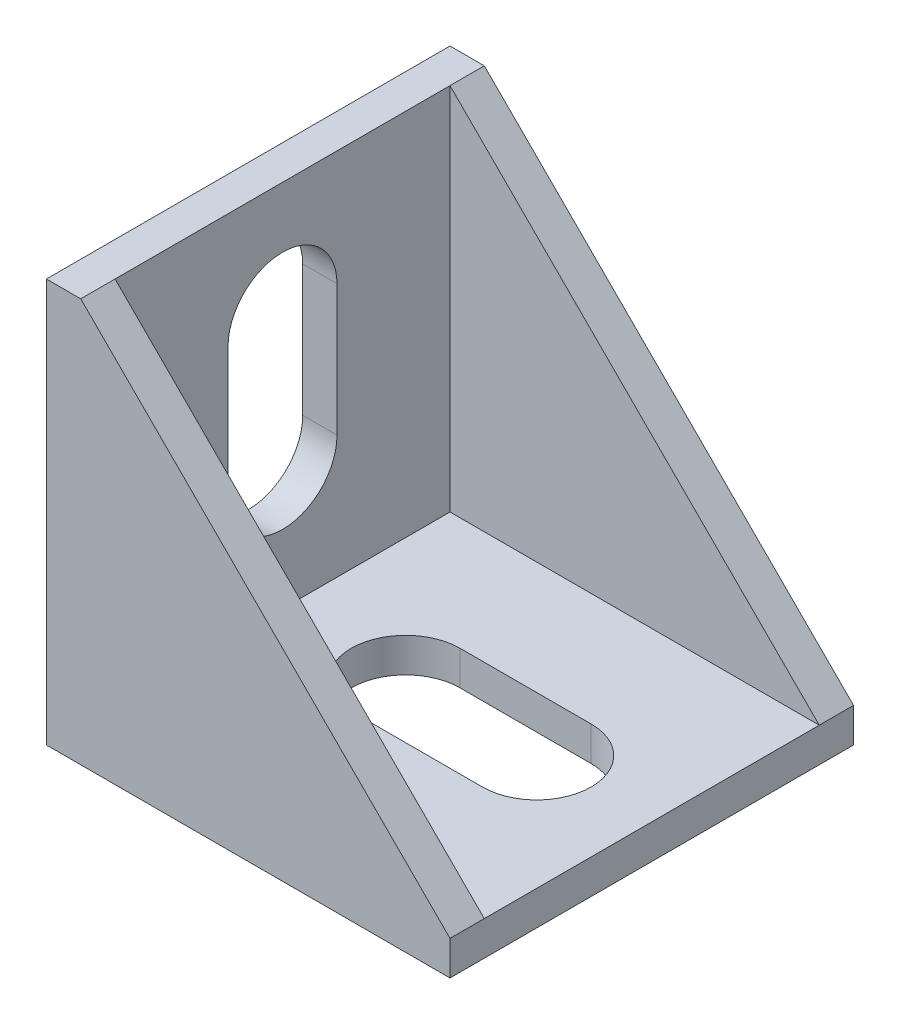
ISO-10303-21;
HEADER;
FILE_DESCRIPTION(('STEP AP214'),'2;1');
FILE_NAME('part.step','',(''),(''),'','','');
FILE_SCHEMA(('AUTOMOTIVE_DESIGN { 1 0 10303 214 1 1 1 1 }'));
ENDSEC;
DATA;
#1=APPLICATION_CONTEXT('core data for automotive mechanical design processes');
#2=APPLICATION_PROTOCOL_DEFINITION('international standard','automotive_design',2000,#1);
#3=PRODUCT_CONTEXT('',#1,'mechanical');
#4=PRODUCT('Part','Part','',(#3));
#5=PRODUCT_RELATED_PRODUCT_CATEGORY('part','',(#4));
#6=PRODUCT_DEFINITION_FORMATION('','',#4);
#7=PRODUCT_DEFINITION_CONTEXT('part definition',#1,'design');
#8=PRODUCT_DEFINITION('design','',#6,#7);
#9=PRODUCT_DEFINITION_SHAPE('','',#8);
#10=(LENGTH_UNIT() NAMED_UNIT(*) SI_UNIT(.MILLI.,.METRE.));
#11=(NAMED_UNIT(*) PLANE_ANGLE_UNIT() SI_UNIT($,.RADIAN.));
#12=(NAMED_UNIT(*) SI_UNIT($,.STERADIAN.) SOLID_ANGLE_UNIT());
#13=UNCERTAINTY_MEASURE_WITH_UNIT(LENGTH_MEASURE(1.E-05),#10,'distance_accuracy_value','');
#14=(GEOMETRIC_REPRESENTATION_CONTEXT(3) GLOBAL_UNCERTAINTY_ASSIGNED_CONTEXT((#13)) GLOBAL_UNIT_ASSIGNED_CONTEXT((#10,
#11,#12)) REPRESENTATION_CONTEXT('',''));
#15=CARTESIAN_POINT('',(0.,0.,0.));
#16=DIRECTION('',(0.,0.,1.));
#17=DIRECTION('',(1.,0.,0.));
#18=AXIS2_PLACEMENT_3D('',#15,#16,#17);
#19=CARTESIAN_POINT('',(0.,1.7,0.));
#20=DIRECTION('',(0.,-1.,0.));
#21=DIRECTION('',(0.,0.,-1.));
#22=AXIS2_PLACEMENT_3D('',#19,#20,#21);
#23=PLANE('',#22);
#24=CARTESIAN_POINT('',(-2.2,1.7,0.));
#25=DIRECTION('',(0.,1.,0.));
#26=DIRECTION('',(0.,0.,1.));
#27=AXIS2_PLACEMENT_3D('',#24,#25,#26);
#28=CIRCLE('',#27,2.7);
#29=CARTESIAN_POINT('',(-2.2,1.7,-2.7));
#30=VERTEX_POINT('',#29);
#31=CARTESIAN_POINT('',(-2.2,1.7,2.7));
#32=VERTEX_POINT('',#31);
#33=EDGE_CURVE('E243',#30,#32,#28,.T.);
#34=ORIENTED_EDGE('',*,*,#33,.F.);
#35=DIRECTION('',(-1.,0.,0.));
#36=VECTOR('',#35,1.);
#37=CARTESIAN_POINT('',(-2.2,1.7,-2.7));
#38=LINE('',#37,#36);
#39=CARTESIAN_POINT('',(4.3,1.7,-2.7));
#40=VERTEX_POINT('',#39);
#41=EDGE_CURVE('E251',#40,#30,#38,.T.);
#42=ORIENTED_EDGE('',*,*,#41,.F.);
#43=CARTESIAN_POINT('',(4.3,1.7,0.));
#44=DIRECTION('',(0.,1.,0.));
#45=DIRECTION('',(0.,0.,1.));
#46=AXIS2_PLACEMENT_3D('',#43,#44,#45);
#47=CIRCLE('',#46,2.7);
#48=CARTESIAN_POINT('',(4.3,1.7,2.7));
#49=VERTEX_POINT('',#48);
#50=EDGE_CURVE('E248',#49,#40,#47,.T.);
#51=ORIENTED_EDGE('',*,*,#50,.F.);
#52=DIRECTION('',(1.,0.,0.));
#53=VECTOR('',#52,1.);
#54=CARTESIAN_POINT('',(-2.2,1.7,2.7));
#55=LINE('',#54,#53);
#56=EDGE_CURVE('E245',#32,#49,#55,.T.);
#57=ORIENTED_EDGE('',*,*,#56,.F.);
#58=EDGE_LOOP('',(#34,#42,#51,#57));
#59=FACE_BOUND('',#58,.T.);
#60=DIRECTION('',(-1.,0.,0.));
#61=VECTOR('',#60,1.);
#62=CARTESIAN_POINT('',(10.,1.7,-8.3));
#63=LINE('',#62,#61);
#64=CARTESIAN_POINT('',(10.,1.7,-8.3));
#65=VERTEX_POINT('',#64);
#66=CARTESIAN_POINT('',(-8.3,1.7,-8.3));
#67=VERTEX_POINT('',#66);
#68=EDGE_CURVE('E185',#65,#67,#63,.T.);
#69=ORIENTED_EDGE('',*,*,#68,.T.);
#70=DIRECTION('',(0.,0.,-1.));
#71=VECTOR('',#70,1.);
#72=CARTESIAN_POINT('',(-8.3,1.7,-10.));
#73=LINE('',#72,#71);
#74=CARTESIAN_POINT('',(-8.3,1.7,8.3));
#75=VERTEX_POINT('',#74);
#76=EDGE_CURVE('E239',#75,#67,#73,.T.);
#77=ORIENTED_EDGE('',*,*,#76,.F.);
#78=DIRECTION('',(-1.,0.,0.));
#79=VECTOR('',#78,1.);
#80=CARTESIAN_POINT('',(10.,1.7,8.3));
#81=LINE('',#80,#79);
#82=CARTESIAN_POINT('',(10.,1.7,8.3));
#83=VERTEX_POINT('',#82);
#84=EDGE_CURVE('E194',#83,#75,#81,.T.);
#85=ORIENTED_EDGE('',*,*,#84,.F.);
#86=DIRECTION('',(0.,0.,-1.));
#87=VECTOR('',#86,1.);
#88=CARTESIAN_POINT('',(10.,1.7,10.));
#89=LINE('',#88,#87);
#90=EDGE_CURVE('E178',#83,#65,#89,.T.);
#91=ORIENTED_EDGE('',*,*,#90,.T.);
#92=EDGE_LOOP('',(#69,#77,#85,#91));
#93=FACE_BOUND('',#92,.T.);
#94=ADVANCED_FACE('F50',(#59,#93),#23,.F.);
#95=CARTESIAN_POINT('',(-8.3,20.,-10.));
#96=DIRECTION('',(-1.,0.,0.));
#97=DIRECTION('',(0.,0.,1.));
#98=AXIS2_PLACEMENT_3D('',#95,#96,#97);
#99=PLANE('',#98);
#100=DIRECTION('',(0.,-1.,0.));
#101=VECTOR('',#100,1.);
#102=CARTESIAN_POINT('',(-8.3,14.3,2.7));
#103=LINE('',#102,#101);
#104=CARTESIAN_POINT('',(-8.3,14.3,2.7));
#105=VERTEX_POINT('',#104);
#106=CARTESIAN_POINT('',(-8.3,7.8,2.7));
#107=VERTEX_POINT('',#106);
#108=EDGE_CURVE('E371',#105,#107,#103,.T.);
#109=ORIENTED_EDGE('',*,*,#108,.F.);
#110=CARTESIAN_POINT('',(-8.3,14.3,0.));
#111=DIRECTION('',(1.,0.,0.));
#112=DIRECTION('',(0.,0.,-1.));
#113=AXIS2_PLACEMENT_3D('',#110,#111,#112);
#114=CIRCLE('',#113,2.7);
#115=CARTESIAN_POINT('',(-8.3,14.3,-2.7));
#116=VERTEX_POINT('',#115);
#117=EDGE_CURVE('E358',#116,#105,#114,.T.);
#118=ORIENTED_EDGE('',*,*,#117,.F.);
#119=DIRECTION('',(0.,1.,0.));
#120=VECTOR('',#119,1.);
#121=CARTESIAN_POINT('',(-8.3,14.3,-2.7));
#122=LINE('',#121,#120);
#123=CARTESIAN_POINT('',(-8.3,7.8,-2.7));
#124=VERTEX_POINT('',#123);
#125=EDGE_CURVE('E377',#124,#116,#122,.T.);
#126=ORIENTED_EDGE('',*,*,#125,.F.);
#127=CARTESIAN_POINT('',(-8.3,7.8,0.));
#128=DIRECTION('',(1.,0.,0.));
#129=DIRECTION('',(0.,0.,-1.));
#130=AXIS2_PLACEMENT_3D('',#127,#128,#129);
#131=CIRCLE('',#130,2.7);
#132=EDGE_CURVE('E374',#107,#124,#131,.T.);
#133=ORIENTED_EDGE('',*,*,#132,.F.);
#134=EDGE_LOOP('',(#109,#118,#126,#133));
#135=FACE_BOUND('',#134,.T.);
#136=DIRECTION('',(0.,-1.,0.));
#137=VECTOR('',#136,1.);
#138=CARTESIAN_POINT('',(-8.3,20.,-8.3));
#139=LINE('',#138,#137);
#140=CARTESIAN_POINT('',(-8.3,20.,-8.3));
#141=VERTEX_POINT('',#140);
#142=EDGE_CURVE('E187',#141,#67,#139,.T.);
#143=ORIENTED_EDGE('',*,*,#142,.F.);
#144=DIRECTION('',(0.,0.,-1.));
#145=VECTOR('',#144,1.);
#146=CARTESIAN_POINT('',(-8.3,20.,-10.));
#147=LINE('',#146,#145);
#148=CARTESIAN_POINT('',(-8.3,20.,8.3));
#149=VERTEX_POINT('',#148);
#150=EDGE_CURVE('E230',#149,#141,#147,.T.);
#151=ORIENTED_EDGE('',*,*,#150,.F.);
#152=DIRECTION('',(0.,1.,0.));
#153=VECTOR('',#152,1.);
#154=CARTESIAN_POINT('',(-8.3,20.,8.3));
#155=LINE('',#154,#153);
#156=EDGE_CURVE('E191',#75,#149,#155,.T.);
#157=ORIENTED_EDGE('',*,*,#156,.F.);
#158=ORIENTED_EDGE('',*,*,#76,.T.);
#159=EDGE_LOOP('',(#143,#151,#157,#158));
#160=FACE_BOUND('',#159,.T.);
#161=ADVANCED_FACE('F296',(#135,#160),#99,.F.);
#162=CARTESIAN_POINT('',(0.,0.,0.));
#163=DIRECTION('',(0.,-1.,0.));
#164=DIRECTION('',(0.,0.,-1.));
#165=AXIS2_PLACEMENT_3D('',#162,#163,#164);
#166=PLANE('',#165);
#167=DIRECTION('',(0.,0.,-1.));
#168=VECTOR('',#167,1.);
#169=CARTESIAN_POINT('',(10.,0.,10.));
#170=LINE('',#169,#168);
#171=CARTESIAN_POINT('',(10.,0.,10.));
#172=VERTEX_POINT('',#171);
#173=CARTESIAN_POINT('',(10.,0.,-10.));
#174=VERTEX_POINT('',#173);
#175=EDGE_CURVE('E207',#172,#174,#170,.T.);
#176=ORIENTED_EDGE('',*,*,#175,.F.);
#177=DIRECTION('',(1.,0.,0.));
#178=VECTOR('',#177,1.);
#179=CARTESIAN_POINT('',(-10.,0.,10.));
#180=LINE('',#179,#178);
#181=CARTESIAN_POINT('',(-10.,0.,10.));
#182=VERTEX_POINT('',#181);
#183=EDGE_CURVE('E196',#182,#172,#180,.T.);
#184=ORIENTED_EDGE('',*,*,#183,.F.);
#185=DIRECTION('',(0.,0.,1.));
#186=VECTOR('',#185,1.);
#187=CARTESIAN_POINT('',(-10.,0.,10.));
#188=LINE('',#187,#186);
#189=CARTESIAN_POINT('',(-10.,0.,-10.));
#190=VERTEX_POINT('',#189);
#191=EDGE_CURVE('E201',#190,#182,#188,.T.);
#192=ORIENTED_EDGE('',*,*,#191,.F.);
#193=DIRECTION('',(-1.,0.,0.));
#194=VECTOR('',#193,1.);
#195=CARTESIAN_POINT('',(-10.,0.,-10.));
#196=LINE('',#195,#194);
#197=EDGE_CURVE('E209',#174,#190,#196,.T.);
#198=ORIENTED_EDGE('',*,*,#197,.F.);
#199=EDGE_LOOP('',(#176,#184,#192,#198));
#200=FACE_BOUND('',#199,.T.);
#201=DIRECTION('',(-1.,0.,0.));
#202=VECTOR('',#201,1.);
#203=CARTESIAN_POINT('',(-2.2,0.,-2.7));
#204=LINE('',#203,#202);
#205=CARTESIAN_POINT('',(4.3,0.,-2.7));
#206=VERTEX_POINT('',#205);
#207=CARTESIAN_POINT('',(-2.2,0.,-2.7));
#208=VERTEX_POINT('',#207);
#209=EDGE_CURVE('E246',#206,#208,#204,.T.);
#210=ORIENTED_EDGE('',*,*,#209,.T.);
#211=CARTESIAN_POINT('',(-2.2,0.,0.));
#212=DIRECTION('',(0.,1.,0.));
#213=DIRECTION('',(0.,0.,1.));
#214=AXIS2_PLACEMENT_3D('',#211,#212,#213);
#215=CIRCLE('',#214,2.7);
#216=CARTESIAN_POINT('',(-2.2,0.,2.7));
#217=VERTEX_POINT('',#216);
#218=EDGE_CURVE('E229',#208,#217,#215,.T.);
#219=ORIENTED_EDGE('',*,*,#218,.T.);
#220=DIRECTION('',(1.,0.,0.));
#221=VECTOR('',#220,1.);
#222=CARTESIAN_POINT('',(-2.2,0.,2.7));
#223=LINE('',#222,#221);
#224=CARTESIAN_POINT('',(4.3,0.,2.7));
#225=VERTEX_POINT('',#224);
#226=EDGE_CURVE('E233',#217,#225,#223,.T.);
#227=ORIENTED_EDGE('',*,*,#226,.T.);
#228=CARTESIAN_POINT('',(4.3,0.,0.));
#229=DIRECTION('',(0.,1.,0.));
#230=DIRECTION('',(0.,0.,1.));
#231=AXIS2_PLACEMENT_3D('',#228,#229,#230);
#232=CIRCLE('',#231,2.7);
#233=EDGE_CURVE('E256',#225,#206,#232,.T.);
#234=ORIENTED_EDGE('',*,*,#233,.T.);
#235=EDGE_LOOP('',(#210,#219,#227,#234));
#236=FACE_BOUND('',#235,.T.);
#237=ADVANCED_FACE('F276',(#200,#236),#166,.T.);
#238=CARTESIAN_POINT('',(10.,1.7,10.));
#239=DIRECTION('',(-1.,0.,0.));
#240=DIRECTION('',(0.,0.,1.));
#241=AXIS2_PLACEMENT_3D('',#238,#239,#240);
#242=PLANE('',#241);
#243=DIRECTION('',(0.,-1.,0.));
#244=VECTOR('',#243,1.);
#245=CARTESIAN_POINT('',(10.,1.7,-10.));
#246=LINE('',#245,#244);
#247=CARTESIAN_POINT('',(10.,1.69999999999999,-10.));
#248=VERTEX_POINT('',#247);
#249=EDGE_CURVE('E181',#248,#174,#246,.T.);
#250=ORIENTED_EDGE('',*,*,#249,.F.);
#251=DIRECTION('',(0.,0.,1.));
#252=VECTOR('',#251,1.);
#253=CARTESIAN_POINT('',(10.,1.69999999999999,-8.3));
#254=LINE('',#253,#252);
#255=EDGE_CURVE('E166',#248,#65,#254,.T.);
#256=ORIENTED_EDGE('',*,*,#255,.T.);
#257=ORIENTED_EDGE('',*,*,#90,.F.);
#258=DIRECTION('',(0.,0.,1.));
#259=VECTOR('',#258,1.);
#260=CARTESIAN_POINT('',(10.,1.69999999999999,10.));
#261=LINE('',#260,#259);
#262=CARTESIAN_POINT('',(10.,1.69999999999999,10.));
#263=VERTEX_POINT('',#262);
#264=EDGE_CURVE('E182',#83,#263,#261,.T.);
#265=ORIENTED_EDGE('',*,*,#264,.T.);
#266=DIRECTION('',(0.,-1.,0.));
#267=VECTOR('',#266,1.);
#268=CARTESIAN_POINT('',(10.,1.7,10.));
#269=LINE('',#268,#267);
#270=EDGE_CURVE('E195',#263,#172,#269,.T.);
#271=ORIENTED_EDGE('',*,*,#270,.T.);
#272=ORIENTED_EDGE('',*,*,#175,.T.);
#273=EDGE_LOOP('',(#250,#256,#257,#265,#271,#272));
#274=FACE_BOUND('',#273,.T.);
#275=ADVANCED_FACE('F175',(#274),#242,.F.);
#276=CARTESIAN_POINT('',(-10.,1.7,-10.));
#277=DIRECTION('',(0.,0.,1.));
#278=DIRECTION('',(1.,0.,0.));
#279=AXIS2_PLACEMENT_3D('',#276,#277,#278);
#280=PLANE('',#279);
#281=DIRECTION('',(-1.,0.,0.));
#282=VECTOR('',#281,1.);
#283=CARTESIAN_POINT('',(-10.,20.,-10.));
#284=LINE('',#283,#282);
#285=CARTESIAN_POINT('',(-8.30000000000007,20.,-10.));
#286=VERTEX_POINT('',#285);
#287=CARTESIAN_POINT('',(-10.,20.,-10.));
#288=VERTEX_POINT('',#287);
#289=EDGE_CURVE('E226',#286,#288,#284,.T.);
#290=ORIENTED_EDGE('',*,*,#289,.F.);
#291=DIRECTION('',(0.707106781186549,-0.707106781186546,0.));
#292=VECTOR('',#291,1.);
#293=CARTESIAN_POINT('',(10.,1.69999999999999,-10.));
#294=LINE('',#293,#292);
#295=EDGE_CURVE('E221',#286,#248,#294,.T.);
#296=ORIENTED_EDGE('',*,*,#295,.T.);
#297=ORIENTED_EDGE('',*,*,#249,.T.);
#298=ORIENTED_EDGE('',*,*,#197,.T.);
#299=DIRECTION('',(0.,-1.,0.));
#300=VECTOR('',#299,1.);
#301=CARTESIAN_POINT('',(-10.,1.7,-10.));
#302=LINE('',#301,#300);
#303=EDGE_CURVE('E214',#288,#190,#302,.T.);
#304=ORIENTED_EDGE('',*,*,#303,.F.);
#305=EDGE_LOOP('',(#290,#296,#297,#298,#304));
#306=FACE_BOUND('',#305,.T.);
#307=ADVANCED_FACE('F223',(#306),#280,.F.);
#308=CARTESIAN_POINT('',(-10.,1.7,10.));
#309=DIRECTION('',(1.,0.,0.));
#310=DIRECTION('',(0.,0.,-1.));
#311=AXIS2_PLACEMENT_3D('',#308,#309,#310);
#312=PLANE('',#311);
#313=DIRECTION('',(0.,-1.,0.));
#314=VECTOR('',#313,1.);
#315=CARTESIAN_POINT('',(-10.,14.3,-2.7));
#316=LINE('',#315,#314);
#317=CARTESIAN_POINT('',(-10.,14.3,-2.7));
#318=VERTEX_POINT('',#317);
#319=CARTESIAN_POINT('',(-10.,7.8,-2.7));
#320=VERTEX_POINT('',#319);
#321=EDGE_CURVE('E365',#318,#320,#316,.T.);
#322=ORIENTED_EDGE('',*,*,#321,.F.);
#323=CARTESIAN_POINT('',(-10.,14.3,0.));
#324=DIRECTION('',(1.,0.,0.));
#325=DIRECTION('',(0.,0.,-1.));
#326=AXIS2_PLACEMENT_3D('',#323,#324,#325);
#327=CIRCLE('',#326,2.7);
#328=CARTESIAN_POINT('',(-10.,14.3,2.7));
#329=VERTEX_POINT('',#328);
#330=EDGE_CURVE('E368',#329,#318,#327,.F.);
#331=ORIENTED_EDGE('',*,*,#330,.F.);
#332=DIRECTION('',(0.,1.,0.));
#333=VECTOR('',#332,1.);
#334=CARTESIAN_POINT('',(-10.,14.3,2.7));
#335=LINE('',#334,#333);
#336=CARTESIAN_POINT('',(-10.,7.8,2.7));
#337=VERTEX_POINT('',#336);
#338=EDGE_CURVE('E242',#337,#329,#335,.T.);
#339=ORIENTED_EDGE('',*,*,#338,.F.);
#340=CARTESIAN_POINT('',(-10.,7.8,0.));
#341=DIRECTION('',(1.,0.,0.));
#342=DIRECTION('',(0.,0.,-1.));
#343=AXIS2_PLACEMENT_3D('',#340,#341,#342);
#344=CIRCLE('',#343,2.7);
#345=EDGE_CURVE('E362',#320,#337,#344,.F.);
#346=ORIENTED_EDGE('',*,*,#345,.F.);
#347=EDGE_LOOP('',(#322,#331,#339,#346));
#348=FACE_BOUND('',#347,.T.);
#349=ORIENTED_EDGE('',*,*,#191,.T.);
#350=DIRECTION('',(0.,-1.,0.));
#351=VECTOR('',#350,1.);
#352=CARTESIAN_POINT('',(-10.,1.7,10.));
#353=LINE('',#352,#351);
#354=CARTESIAN_POINT('',(-10.,20.,10.));
#355=VERTEX_POINT('',#354);
#356=EDGE_CURVE('E198',#355,#182,#353,.T.);
#357=ORIENTED_EDGE('',*,*,#356,.F.);
#358=DIRECTION('',(0.,0.,1.));
#359=VECTOR('',#358,1.);
#360=CARTESIAN_POINT('',(-10.,20.,-10.));
#361=LINE('',#360,#359);
#362=EDGE_CURVE('E241',#288,#355,#361,.T.);
#363=ORIENTED_EDGE('',*,*,#362,.F.);
#364=ORIENTED_EDGE('',*,*,#303,.T.);
#365=EDGE_LOOP('',(#349,#357,#363,#364));
#366=FACE_BOUND('',#365,.T.);
#367=ADVANCED_FACE('F311',(#348,#366),#312,.F.);
#368=CARTESIAN_POINT('',(-10.,1.7,10.));
#369=DIRECTION('',(0.,0.,-1.));
#370=DIRECTION('',(-1.,0.,0.));
#371=AXIS2_PLACEMENT_3D('',#368,#369,#370);
#372=PLANE('',#371);
#373=ORIENTED_EDGE('',*,*,#270,.F.);
#374=DIRECTION('',(-0.707106781186549,0.707106781186546,0.));
#375=VECTOR('',#374,1.);
#376=CARTESIAN_POINT('',(10.,1.69999999999999,10.));
#377=LINE('',#376,#375);
#378=CARTESIAN_POINT('',(-8.30000000000007,20.,10.));
#379=VERTEX_POINT('',#378);
#380=EDGE_CURVE('E58',#263,#379,#377,.T.);
#381=ORIENTED_EDGE('',*,*,#380,.T.);
#382=DIRECTION('',(1.,0.,0.));
#383=VECTOR('',#382,1.);
#384=CARTESIAN_POINT('',(-10.,20.,10.));
#385=LINE('',#384,#383);
#386=EDGE_CURVE('E235',#355,#379,#385,.T.);
#387=ORIENTED_EDGE('',*,*,#386,.F.);
#388=ORIENTED_EDGE('',*,*,#356,.T.);
#389=ORIENTED_EDGE('',*,*,#183,.T.);
#390=EDGE_LOOP('',(#373,#381,#387,#388,#389));
#391=FACE_BOUND('',#390,.T.);
#392=ADVANCED_FACE('F308',(#391),#372,.F.);
#393=CARTESIAN_POINT('',(-2.2,1.7,0.));
#394=DIRECTION('',(0.,-1.,0.));
#395=DIRECTION('',(0.,0.,-1.));
#396=AXIS2_PLACEMENT_3D('',#393,#394,#395);
#397=CYLINDRICAL_SURFACE('',#396,2.7);
#398=ORIENTED_EDGE('',*,*,#218,.F.);
#399=DIRECTION('',(0.,-1.,0.));
#400=VECTOR('',#399,1.);
#401=CARTESIAN_POINT('',(-2.2,1.7,-2.7));
#402=LINE('',#401,#400);
#403=EDGE_CURVE('E252',#30,#208,#402,.T.);
#404=ORIENTED_EDGE('',*,*,#403,.F.);
#405=ORIENTED_EDGE('',*,*,#33,.T.);
#406=DIRECTION('',(0.,-1.,0.));
#407=VECTOR('',#406,1.);
#408=CARTESIAN_POINT('',(-2.2,1.7,2.7));
#409=LINE('',#408,#407);
#410=EDGE_CURVE('E205',#32,#217,#409,.T.);
#411=ORIENTED_EDGE('',*,*,#410,.T.);
#412=EDGE_LOOP('',(#398,#404,#405,#411));
#413=FACE_BOUND('',#412,.T.);
#414=ADVANCED_FACE('F271',(#413),#397,.F.);
#415=CARTESIAN_POINT('',(-2.2,1.7,2.7));
#416=DIRECTION('',(0.,0.,-1.));
#417=DIRECTION('',(-1.,0.,0.));
#418=AXIS2_PLACEMENT_3D('',#415,#416,#417);
#419=PLANE('',#418);
#420=ORIENTED_EDGE('',*,*,#226,.F.);
#421=ORIENTED_EDGE('',*,*,#410,.F.);
#422=ORIENTED_EDGE('',*,*,#56,.T.);
#423=DIRECTION('',(0.,-1.,0.));
#424=VECTOR('',#423,1.);
#425=CARTESIAN_POINT('',(4.3,1.7,2.7));
#426=LINE('',#425,#424);
#427=EDGE_CURVE('E264',#49,#225,#426,.T.);
#428=ORIENTED_EDGE('',*,*,#427,.T.);
#429=EDGE_LOOP('',(#420,#421,#422,#428));
#430=FACE_BOUND('',#429,.T.);
#431=ADVANCED_FACE('F283',(#430),#419,.T.);
#432=CARTESIAN_POINT('',(4.3,1.7,0.));
#433=DIRECTION('',(0.,-1.,0.));
#434=DIRECTION('',(0.,0.,-1.));
#435=AXIS2_PLACEMENT_3D('',#432,#433,#434);
#436=CYLINDRICAL_SURFACE('',#435,2.7);
#437=ORIENTED_EDGE('',*,*,#233,.F.);
#438=ORIENTED_EDGE('',*,*,#427,.F.);
#439=ORIENTED_EDGE('',*,*,#50,.T.);
#440=DIRECTION('',(0.,-1.,0.));
#441=VECTOR('',#440,1.);
#442=CARTESIAN_POINT('',(4.3,1.7,-2.7));
#443=LINE('',#442,#441);
#444=EDGE_CURVE('E263',#40,#206,#443,.T.);
#445=ORIENTED_EDGE('',*,*,#444,.T.);
#446=EDGE_LOOP('',(#437,#438,#439,#445));
#447=FACE_BOUND('',#446,.T.);
#448=ADVANCED_FACE('F285',(#447),#436,.F.);
#449=CARTESIAN_POINT('',(-2.2,1.7,-2.7));
#450=DIRECTION('',(0.,0.,1.));
#451=DIRECTION('',(1.,0.,0.));
#452=AXIS2_PLACEMENT_3D('',#449,#450,#451);
#453=PLANE('',#452);
#454=ORIENTED_EDGE('',*,*,#209,.F.);
#455=ORIENTED_EDGE('',*,*,#444,.F.);
#456=ORIENTED_EDGE('',*,*,#41,.T.);
#457=ORIENTED_EDGE('',*,*,#403,.T.);
#458=EDGE_LOOP('',(#454,#455,#456,#457));
#459=FACE_BOUND('',#458,.T.);
#460=ADVANCED_FACE('F279',(#459),#453,.T.);
#461=CARTESIAN_POINT('',(0.,20.,0.));
#462=DIRECTION('',(0.,1.,0.));
#463=DIRECTION('',(0.,0.,1.));
#464=AXIS2_PLACEMENT_3D('',#461,#462,#463);
#465=PLANE('',#464);
#466=ORIENTED_EDGE('',*,*,#150,.T.);
#467=DIRECTION('',(0.,0.,-1.));
#468=VECTOR('',#467,1.);
#469=CARTESIAN_POINT('',(-8.30000000000007,20.,-10.));
#470=LINE('',#469,#468);
#471=EDGE_CURVE('E65',#141,#286,#470,.T.);
#472=ORIENTED_EDGE('',*,*,#471,.T.);
#473=ORIENTED_EDGE('',*,*,#289,.T.);
#474=ORIENTED_EDGE('',*,*,#362,.T.);
#475=ORIENTED_EDGE('',*,*,#386,.T.);
#476=DIRECTION('',(0.,0.,-1.));
#477=VECTOR('',#476,1.);
#478=CARTESIAN_POINT('',(-8.30000000000007,20.,8.3));
#479=LINE('',#478,#477);
#480=EDGE_CURVE('E170',#379,#149,#479,.T.);
#481=ORIENTED_EDGE('',*,*,#480,.T.);
#482=EDGE_LOOP('',(#466,#472,#473,#474,#475,#481));
#483=FACE_BOUND('',#482,.T.);
#484=ADVANCED_FACE('F292',(#483),#465,.T.);
#485=CARTESIAN_POINT('',(-23.0678996016958,14.3,0.));
#486=DIRECTION('',(1.,0.,0.));
#487=DIRECTION('',(0.,0.,-1.));
#488=AXIS2_PLACEMENT_3D('',#485,#486,#487);
#489=CYLINDRICAL_SURFACE('',#488,2.7);
#490=ORIENTED_EDGE('',*,*,#330,.T.);
#491=DIRECTION('',(1.,0.,0.));
#492=VECTOR('',#491,1.);
#493=CARTESIAN_POINT('',(-23.0678996016958,14.3,-2.7));
#494=LINE('',#493,#492);
#495=EDGE_CURVE('E366',#318,#116,#494,.T.);
#496=ORIENTED_EDGE('',*,*,#495,.T.);
#497=ORIENTED_EDGE('',*,*,#117,.T.);
#498=DIRECTION('',(1.,0.,0.));
#499=VECTOR('',#498,1.);
#500=CARTESIAN_POINT('',(-23.0678996016958,14.3,2.7));
#501=LINE('',#500,#499);
#502=EDGE_CURVE('E380',#329,#105,#501,.T.);
#503=ORIENTED_EDGE('',*,*,#502,.F.);
#504=EDGE_LOOP('',(#490,#496,#497,#503));
#505=FACE_BOUND('',#504,.T.);
#506=ADVANCED_FACE('F337',(#505),#489,.F.);
#507=CARTESIAN_POINT('',(-23.0678996016958,14.3,-2.7));
#508=DIRECTION('',(0.,0.,-1.));
#509=DIRECTION('',(0.,1.,0.));
#510=AXIS2_PLACEMENT_3D('',#507,#508,#509);
#511=PLANE('',#510);
#512=ORIENTED_EDGE('',*,*,#321,.T.);
#513=DIRECTION('',(1.,0.,0.));
#514=VECTOR('',#513,1.);
#515=CARTESIAN_POINT('',(-23.0678996016958,7.8,-2.7));
#516=LINE('',#515,#514);
#517=EDGE_CURVE('E382',#320,#124,#516,.T.);
#518=ORIENTED_EDGE('',*,*,#517,.T.);
#519=ORIENTED_EDGE('',*,*,#125,.T.);
#520=ORIENTED_EDGE('',*,*,#495,.F.);
#521=EDGE_LOOP('',(#512,#518,#519,#520));
#522=FACE_BOUND('',#521,.T.);
#523=ADVANCED_FACE('F333',(#522),#511,.F.);
#524=CARTESIAN_POINT('',(-23.0678996016958,7.8,0.));
#525=DIRECTION('',(1.,0.,0.));
#526=DIRECTION('',(0.,0.,-1.));
#527=AXIS2_PLACEMENT_3D('',#524,#525,#526);
#528=CYLINDRICAL_SURFACE('',#527,2.7);
#529=ORIENTED_EDGE('',*,*,#345,.T.);
#530=DIRECTION('',(1.,0.,0.));
#531=VECTOR('',#530,1.);
#532=CARTESIAN_POINT('',(-23.0678996016958,7.8,2.7));
#533=LINE('',#532,#531);
#534=EDGE_CURVE('E384',#337,#107,#533,.T.);
#535=ORIENTED_EDGE('',*,*,#534,.T.);
#536=ORIENTED_EDGE('',*,*,#132,.T.);
#537=ORIENTED_EDGE('',*,*,#517,.F.);
#538=EDGE_LOOP('',(#529,#535,#536,#537));
#539=FACE_BOUND('',#538,.T.);
#540=ADVANCED_FACE('F336',(#539),#528,.F.);
#541=CARTESIAN_POINT('',(-23.0678996016958,14.3,2.7));
#542=DIRECTION('',(0.,0.,1.));
#543=DIRECTION('',(1.,0.,0.));
#544=AXIS2_PLACEMENT_3D('',#541,#542,#543);
#545=PLANE('',#544);
#546=ORIENTED_EDGE('',*,*,#338,.T.);
#547=ORIENTED_EDGE('',*,*,#502,.T.);
#548=ORIENTED_EDGE('',*,*,#108,.T.);
#549=ORIENTED_EDGE('',*,*,#534,.F.);
#550=EDGE_LOOP('',(#546,#547,#548,#549));
#551=FACE_BOUND('',#550,.T.);
#552=ADVANCED_FACE('F329',(#551),#545,.F.);
#553=CARTESIAN_POINT('',(10.,20.,8.3));
#554=DIRECTION('',(0.,0.,1.));
#555=DIRECTION('',(0.,-1.,0.));
#556=AXIS2_PLACEMENT_3D('',#553,#554,#555);
#557=PLANE('',#556);
#558=ORIENTED_EDGE('',*,*,#156,.T.);
#559=DIRECTION('',(0.707106781186549,-0.707106781186546,0.));
#560=VECTOR('',#559,1.);
#561=CARTESIAN_POINT('',(10.,1.69999999999999,8.3));
#562=LINE('',#561,#560);
#563=EDGE_CURVE('E13',#149,#83,#562,.T.);
#564=ORIENTED_EDGE('',*,*,#563,.T.);
#565=ORIENTED_EDGE('',*,*,#84,.T.);
#566=EDGE_LOOP('',(#558,#564,#565));
#567=FACE_BOUND('',#566,.T.);
#568=ADVANCED_FACE('F324',(#567),#557,.F.);
#569=CARTESIAN_POINT('',(10.,20.,-8.3));
#570=DIRECTION('',(0.,0.,-1.));
#571=DIRECTION('',(0.,1.,0.));
#572=AXIS2_PLACEMENT_3D('',#569,#570,#571);
#573=PLANE('',#572);
#574=ORIENTED_EDGE('',*,*,#68,.F.);
#575=DIRECTION('',(-0.707106781186549,0.707106781186546,0.));
#576=VECTOR('',#575,1.);
#577=CARTESIAN_POINT('',(10.,1.69999999999999,-8.3));
#578=LINE('',#577,#576);
#579=EDGE_CURVE('E162',#65,#141,#578,.T.);
#580=ORIENTED_EDGE('',*,*,#579,.T.);
#581=ORIENTED_EDGE('',*,*,#142,.T.);
#582=EDGE_LOOP('',(#574,#580,#581));
#583=FACE_BOUND('',#582,.T.);
#584=ADVANCED_FACE('F186',(#583),#573,.F.);
#585=CARTESIAN_POINT('',(10.,1.69999999999999,10.));
#586=DIRECTION('',(0.707106781186546,0.707106781186549,0.));
#587=DIRECTION('',(0.,0.,-1.));
#588=AXIS2_PLACEMENT_3D('',#585,#586,#587);
#589=PLANE('',#588);
#590=ORIENTED_EDGE('',*,*,#295,.F.);
#591=ORIENTED_EDGE('',*,*,#471,.F.);
#592=ORIENTED_EDGE('',*,*,#579,.F.);
#593=ORIENTED_EDGE('',*,*,#255,.F.);
#594=EDGE_LOOP('',(#590,#591,#592,#593));
#595=FACE_BOUND('',#594,.T.);
#596=ADVANCED_FACE('F165',(#595),#589,.T.);
#597=CARTESIAN_POINT('',(10.,1.69999999999999,10.));
#598=DIRECTION('',(0.707106781186546,0.707106781186549,0.));
#599=DIRECTION('',(0.,0.,-1.));
#600=AXIS2_PLACEMENT_3D('',#597,#598,#599);
#601=PLANE('',#600);
#602=ORIENTED_EDGE('',*,*,#563,.F.);
#603=ORIENTED_EDGE('',*,*,#480,.F.);
#604=ORIENTED_EDGE('',*,*,#380,.F.);
#605=ORIENTED_EDGE('',*,*,#264,.F.);
#606=EDGE_LOOP('',(#602,#603,#604,#605));
#607=FACE_BOUND('',#606,.T.);
#608=ADVANCED_FACE('F52',(#607),#601,.T.);
#609=CLOSED_SHELL('',(#94,#161,#237,#275,#307,#367,#392,#414,#431,#448,#460,#484,#506,#523,#540,
#552,#568,#584,#596,#608));
#610=MANIFOLD_SOLID_BREP('B2',#609);
#611=ADVANCED_BREP_SHAPE_REPRESENTATION('',(#18,#610),#14);
#612=SHAPE_DEFINITION_REPRESENTATION(#9,#611);
ENDSEC;
END-ISO-10303-21;
